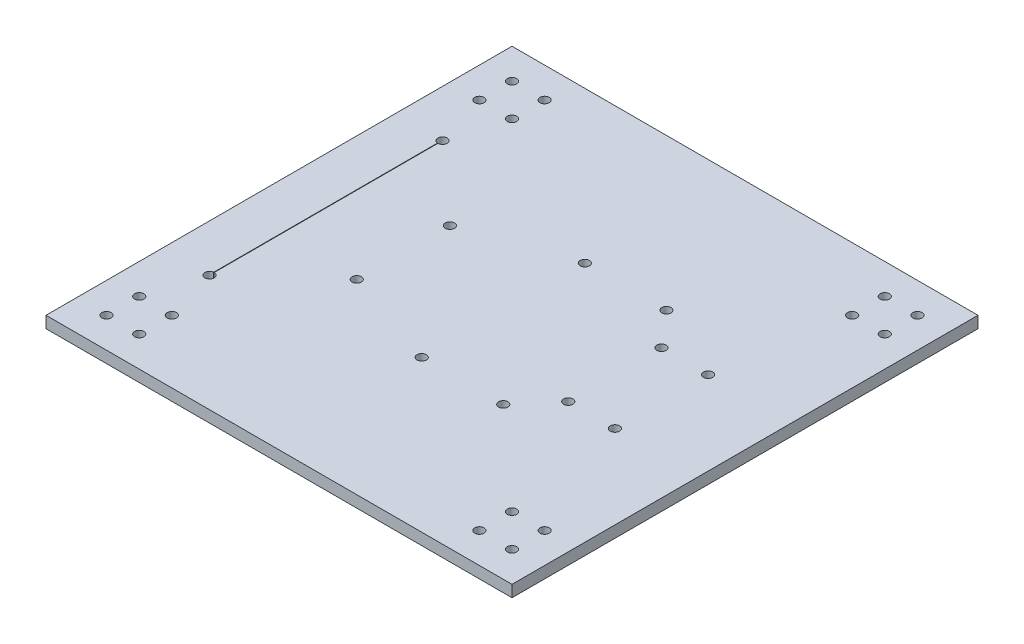
ISO-10303-21;
HEADER;
FILE_DESCRIPTION(('STEP AP214'),'2;1');
FILE_NAME('part.step','',(''),(''),'','','');
FILE_SCHEMA(('AUTOMOTIVE_DESIGN { 1 0 10303 214 1 1 1 1 }'));
ENDSEC;
DATA;
#1=APPLICATION_CONTEXT('core data for automotive mechanical design processes');
#2=APPLICATION_PROTOCOL_DEFINITION('international standard','automotive_design',2000,#1);
#3=PRODUCT_CONTEXT('',#1,'mechanical');
#4=PRODUCT('Part','Part','',(#3));
#5=PRODUCT_RELATED_PRODUCT_CATEGORY('part','',(#4));
#6=PRODUCT_DEFINITION_FORMATION('','',#4);
#7=PRODUCT_DEFINITION_CONTEXT('part definition',#1,'design');
#8=PRODUCT_DEFINITION('design','',#6,#7);
#9=PRODUCT_DEFINITION_SHAPE('','',#8);
#10=(LENGTH_UNIT() NAMED_UNIT(*) SI_UNIT(.MILLI.,.METRE.));
#11=(NAMED_UNIT(*) PLANE_ANGLE_UNIT() SI_UNIT($,.RADIAN.));
#12=(NAMED_UNIT(*) SI_UNIT($,.STERADIAN.) SOLID_ANGLE_UNIT());
#13=UNCERTAINTY_MEASURE_WITH_UNIT(LENGTH_MEASURE(1.E-05),#10,'distance_accuracy_value','');
#14=(GEOMETRIC_REPRESENTATION_CONTEXT(3) GLOBAL_UNCERTAINTY_ASSIGNED_CONTEXT((#13)) GLOBAL_UNIT_ASSIGNED_CONTEXT((#10,
#11,#12)) REPRESENTATION_CONTEXT('',''));
#15=CARTESIAN_POINT('',(0.,0.,0.));
#16=DIRECTION('',(0.,0.,1.));
#17=DIRECTION('',(1.,0.,0.));
#18=AXIS2_PLACEMENT_3D('',#15,#16,#17);
#19=CARTESIAN_POINT('',(0.,5.,-100.));
#20=DIRECTION('',(0.,0.,-1.));
#21=DIRECTION('',(-1.,0.,0.));
#22=AXIS2_PLACEMENT_3D('',#19,#20,#21);
#23=PLANE('',#22);
#24=DIRECTION('',(1.,0.,0.));
#25=VECTOR('',#24,1.);
#26=CARTESIAN_POINT('',(0.,0.,-100.));
#27=LINE('',#26,#25);
#28=CARTESIAN_POINT('',(-100.,0.,-100.));
#29=VERTEX_POINT('',#28);
#30=CARTESIAN_POINT('',(100.,0.,-100.));
#31=VERTEX_POINT('',#30);
#32=EDGE_CURVE('E178',#29,#31,#27,.T.);
#33=ORIENTED_EDGE('',*,*,#32,.F.);
#34=DIRECTION('',(0.,-1.,0.));
#35=VECTOR('',#34,1.);
#36=CARTESIAN_POINT('',(-100.,5.,-100.));
#37=LINE('',#36,#35);
#38=CARTESIAN_POINT('',(-100.,5.,-100.));
#39=VERTEX_POINT('',#38);
#40=EDGE_CURVE('E11',#39,#29,#37,.T.);
#41=ORIENTED_EDGE('',*,*,#40,.F.);
#42=DIRECTION('',(1.,0.,0.));
#43=VECTOR('',#42,1.);
#44=CARTESIAN_POINT('',(0.,5.,-100.));
#45=LINE('',#44,#43);
#46=CARTESIAN_POINT('',(100.,5.,-100.));
#47=VERTEX_POINT('',#46);
#48=EDGE_CURVE('E129',#39,#47,#45,.T.);
#49=ORIENTED_EDGE('',*,*,#48,.T.);
#50=DIRECTION('',(0.,-1.,0.));
#51=VECTOR('',#50,1.);
#52=CARTESIAN_POINT('',(100.,5.,-100.));
#53=LINE('',#52,#51);
#54=EDGE_CURVE('E61',#47,#31,#53,.T.);
#55=ORIENTED_EDGE('',*,*,#54,.T.);
#56=EDGE_LOOP('',(#33,#41,#49,#55));
#57=FACE_BOUND('',#56,.T.);
#58=ADVANCED_FACE('F41',(#57),#23,.T.);
#59=CARTESIAN_POINT('',(-100.,5.,0.));
#60=DIRECTION('',(1.,0.,0.));
#61=DIRECTION('',(0.,0.,-1.));
#62=AXIS2_PLACEMENT_3D('',#59,#60,#61);
#63=PLANE('',#62);
#64=DIRECTION('',(0.,0.,1.));
#65=VECTOR('',#64,1.);
#66=CARTESIAN_POINT('',(-100.,0.,0.));
#67=LINE('',#66,#65);
#68=CARTESIAN_POINT('',(-100.,0.,100.));
#69=VERTEX_POINT('',#68);
#70=EDGE_CURVE('E135',#29,#69,#67,.T.);
#71=ORIENTED_EDGE('',*,*,#70,.T.);
#72=DIRECTION('',(0.,-1.,0.));
#73=VECTOR('',#72,1.);
#74=CARTESIAN_POINT('',(-100.,5.,100.));
#75=LINE('',#74,#73);
#76=CARTESIAN_POINT('',(-100.,5.,100.));
#77=VERTEX_POINT('',#76);
#78=EDGE_CURVE('E52',#77,#69,#75,.T.);
#79=ORIENTED_EDGE('',*,*,#78,.F.);
#80=DIRECTION('',(0.,0.,1.));
#81=VECTOR('',#80,1.);
#82=CARTESIAN_POINT('',(-100.,5.,0.));
#83=LINE('',#82,#81);
#84=EDGE_CURVE('E123',#39,#77,#83,.T.);
#85=ORIENTED_EDGE('',*,*,#84,.F.);
#86=ORIENTED_EDGE('',*,*,#40,.T.);
#87=EDGE_LOOP('',(#71,#79,#85,#86));
#88=FACE_BOUND('',#87,.T.);
#89=ADVANCED_FACE('F133',(#88),#63,.F.);
#90=CARTESIAN_POINT('',(0.,5.,100.));
#91=DIRECTION('',(0.,0.,-1.));
#92=DIRECTION('',(-1.,0.,0.));
#93=AXIS2_PLACEMENT_3D('',#90,#91,#92);
#94=PLANE('',#93);
#95=DIRECTION('',(1.,0.,0.));
#96=VECTOR('',#95,1.);
#97=CARTESIAN_POINT('',(0.,0.,100.));
#98=LINE('',#97,#96);
#99=CARTESIAN_POINT('',(100.,0.,100.));
#100=VERTEX_POINT('',#99);
#101=EDGE_CURVE('E173',#69,#100,#98,.T.);
#102=ORIENTED_EDGE('',*,*,#101,.T.);
#103=DIRECTION('',(0.,-1.,0.));
#104=VECTOR('',#103,1.);
#105=CARTESIAN_POINT('',(100.,5.,100.));
#106=LINE('',#105,#104);
#107=CARTESIAN_POINT('',(100.,5.,100.));
#108=VERTEX_POINT('',#107);
#109=EDGE_CURVE('E87',#108,#100,#106,.T.);
#110=ORIENTED_EDGE('',*,*,#109,.F.);
#111=DIRECTION('',(1.,0.,0.));
#112=VECTOR('',#111,1.);
#113=CARTESIAN_POINT('',(0.,5.,100.));
#114=LINE('',#113,#112);
#115=EDGE_CURVE('E114',#77,#108,#114,.T.);
#116=ORIENTED_EDGE('',*,*,#115,.F.);
#117=ORIENTED_EDGE('',*,*,#78,.T.);
#118=EDGE_LOOP('',(#102,#110,#116,#117));
#119=FACE_BOUND('',#118,.T.);
#120=ADVANCED_FACE('F116',(#119),#94,.F.);
#121=CARTESIAN_POINT('',(-79.8057915057915,5.,-50.));
#122=DIRECTION('',(0.,-1.,0.));
#123=DIRECTION('',(0.,0.,-1.));
#124=AXIS2_PLACEMENT_3D('',#121,#122,#123);
#125=CYLINDRICAL_SURFACE('',#124,2.);
#126=CARTESIAN_POINT('',(-79.8057915057915,0.,-50.));
#127=DIRECTION('',(0.,1.,0.));
#128=DIRECTION('',(0.,0.,1.));
#129=AXIS2_PLACEMENT_3D('',#126,#127,#128);
#130=CIRCLE('',#129,2.);
#131=CARTESIAN_POINT('',(-79.8057915057915,0.,-48.));
#132=VERTEX_POINT('',#131);
#133=CARTESIAN_POINT('',(-80.,0.,-48.0094515678393));
#134=VERTEX_POINT('',#133);
#135=EDGE_CURVE('E264',#132,#134,#130,.T.);
#136=ORIENTED_EDGE('',*,*,#135,.F.);
#137=DIRECTION('',(0.,-1.,0.));
#138=VECTOR('',#137,1.);
#139=CARTESIAN_POINT('',(-79.8057915057915,5.,-48.));
#140=LINE('',#139,#138);
#141=CARTESIAN_POINT('',(-79.8057915057915,5.,-48.));
#142=VERTEX_POINT('',#141);
#143=EDGE_CURVE('E45',#142,#132,#140,.T.);
#144=ORIENTED_EDGE('',*,*,#143,.F.);
#145=CARTESIAN_POINT('',(-79.8057915057915,5.,-50.));
#146=DIRECTION('',(0.,1.,0.));
#147=DIRECTION('',(0.,0.,1.));
#148=AXIS2_PLACEMENT_3D('',#145,#146,#147);
#149=CIRCLE('',#148,2.);
#150=CARTESIAN_POINT('',(-80.,5.,-48.0094515678393));
#151=VERTEX_POINT('',#150);
#152=EDGE_CURVE('E384',#142,#151,#149,.T.);
#153=ORIENTED_EDGE('',*,*,#152,.T.);
#154=DIRECTION('',(0.,-1.,0.));
#155=VECTOR('',#154,1.);
#156=CARTESIAN_POINT('',(-80.,5.,-48.0094515678393));
#157=LINE('',#156,#155);
#158=EDGE_CURVE('E142',#151,#134,#157,.T.);
#159=ORIENTED_EDGE('',*,*,#158,.T.);
#160=EDGE_LOOP('',(#136,#144,#153,#159));
#161=FACE_BOUND('',#160,.T.);
#162=ADVANCED_FACE('F578',(#161),#125,.F.);
#163=CARTESIAN_POINT('',(-79.8057915057915,5.,0.));
#164=DIRECTION('',(1.,0.,0.));
#165=DIRECTION('',(0.,0.,-1.));
#166=AXIS2_PLACEMENT_3D('',#163,#164,#165);
#167=PLANE('',#166);
#168=DIRECTION('',(0.,0.,1.));
#169=VECTOR('',#168,1.);
#170=CARTESIAN_POINT('',(-79.8057915057915,0.,0.));
#171=LINE('',#170,#169);
#172=CARTESIAN_POINT('',(-79.8057915057915,0.,48.));
#173=VERTEX_POINT('',#172);
#174=EDGE_CURVE('E261',#132,#173,#171,.T.);
#175=ORIENTED_EDGE('',*,*,#174,.T.);
#176=DIRECTION('',(0.,-1.,0.));
#177=VECTOR('',#176,1.);
#178=CARTESIAN_POINT('',(-79.8057915057915,5.,48.));
#179=LINE('',#178,#177);
#180=CARTESIAN_POINT('',(-79.8057915057915,5.,48.));
#181=VERTEX_POINT('',#180);
#182=EDGE_CURVE('E148',#181,#173,#179,.T.);
#183=ORIENTED_EDGE('',*,*,#182,.F.);
#184=DIRECTION('',(0.,0.,1.));
#185=VECTOR('',#184,1.);
#186=CARTESIAN_POINT('',(-79.8057915057915,5.,0.));
#187=LINE('',#186,#185);
#188=EDGE_CURVE('E381',#142,#181,#187,.T.);
#189=ORIENTED_EDGE('',*,*,#188,.F.);
#190=ORIENTED_EDGE('',*,*,#143,.T.);
#191=EDGE_LOOP('',(#175,#183,#189,#190));
#192=FACE_BOUND('',#191,.T.);
#193=ADVANCED_FACE('F575',(#192),#167,.F.);
#194=CARTESIAN_POINT('',(-79.8057915057915,5.,50.));
#195=DIRECTION('',(0.,-1.,0.));
#196=DIRECTION('',(0.,0.,-1.));
#197=AXIS2_PLACEMENT_3D('',#194,#195,#196);
#198=CYLINDRICAL_SURFACE('',#197,2.);
#199=CARTESIAN_POINT('',(-79.8057915057915,0.,50.));
#200=DIRECTION('',(0.,1.,0.));
#201=DIRECTION('',(0.,0.,1.));
#202=AXIS2_PLACEMENT_3D('',#199,#200,#201);
#203=CIRCLE('',#202,2.);
#204=CARTESIAN_POINT('',(-80.,0.,48.0094515678393));
#205=VERTEX_POINT('',#204);
#206=EDGE_CURVE('E257',#205,#173,#203,.T.);
#207=ORIENTED_EDGE('',*,*,#206,.F.);
#208=DIRECTION('',(0.,-1.,0.));
#209=VECTOR('',#208,1.);
#210=CARTESIAN_POINT('',(-80.,5.,48.0094515678393));
#211=LINE('',#210,#209);
#212=CARTESIAN_POINT('',(-80.,5.,48.0094515678393));
#213=VERTEX_POINT('',#212);
#214=EDGE_CURVE('E145',#213,#205,#211,.T.);
#215=ORIENTED_EDGE('',*,*,#214,.F.);
#216=CARTESIAN_POINT('',(-79.8057915057915,5.,50.));
#217=DIRECTION('',(0.,1.,0.));
#218=DIRECTION('',(0.,0.,1.));
#219=AXIS2_PLACEMENT_3D('',#216,#217,#218);
#220=CIRCLE('',#219,2.);
#221=EDGE_CURVE('E378',#213,#181,#220,.T.);
#222=ORIENTED_EDGE('',*,*,#221,.T.);
#223=ORIENTED_EDGE('',*,*,#182,.T.);
#224=EDGE_LOOP('',(#207,#215,#222,#223));
#225=FACE_BOUND('',#224,.T.);
#226=ADVANCED_FACE('F571',(#225),#198,.F.);
#227=CARTESIAN_POINT('',(-46.6325171431204,5.,20.));
#228=DIRECTION('',(0.,-1.,0.));
#229=DIRECTION('',(0.,0.,-1.));
#230=AXIS2_PLACEMENT_3D('',#227,#228,#229);
#231=CYLINDRICAL_SURFACE('',#230,2.);
#232=CARTESIAN_POINT('',(-46.6325171431204,5.,20.));
#233=DIRECTION('',(0.,1.,0.));
#234=DIRECTION('',(0.,0.,1.));
#235=AXIS2_PLACEMENT_3D('',#232,#233,#234);
#236=CIRCLE('',#235,2.);
#237=CARTESIAN_POINT('',(-46.6325171431204,5.,22.));
#238=VERTEX_POINT('',#237);
#239=EDGE_CURVE('E295',#238,#238,#236,.T.);
#240=ORIENTED_EDGE('',*,*,#239,.T.);
#241=EDGE_LOOP('',(#240));
#242=FACE_BOUND('',#241,.T.);
#243=CARTESIAN_POINT('',(-46.6325171431204,0.,20.));
#244=DIRECTION('',(0.,1.,0.));
#245=DIRECTION('',(0.,0.,1.));
#246=AXIS2_PLACEMENT_3D('',#243,#244,#245);
#247=CIRCLE('',#246,2.);
#248=CARTESIAN_POINT('',(-46.6325171431204,0.,22.));
#249=VERTEX_POINT('',#248);
#250=EDGE_CURVE('E165',#249,#249,#247,.T.);
#251=ORIENTED_EDGE('',*,*,#250,.F.);
#252=EDGE_LOOP('',(#251));
#253=FACE_BOUND('',#252,.T.);
#254=ADVANCED_FACE('F574',(#242,#253),#231,.F.);
#255=CARTESIAN_POINT('',(100.,5.,0.));
#256=DIRECTION('',(1.,0.,0.));
#257=DIRECTION('',(0.,0.,-1.));
#258=AXIS2_PLACEMENT_3D('',#255,#256,#257);
#259=PLANE('',#258);
#260=DIRECTION('',(0.,0.,1.));
#261=VECTOR('',#260,1.);
#262=CARTESIAN_POINT('',(100.,0.,0.));
#263=LINE('',#262,#261);
#264=EDGE_CURVE('E169',#31,#100,#263,.T.);
#265=ORIENTED_EDGE('',*,*,#264,.F.);
#266=ORIENTED_EDGE('',*,*,#54,.F.);
#267=DIRECTION('',(0.,0.,1.));
#268=VECTOR('',#267,1.);
#269=CARTESIAN_POINT('',(100.,5.,0.));
#270=LINE('',#269,#268);
#271=EDGE_CURVE('E122',#47,#108,#270,.T.);
#272=ORIENTED_EDGE('',*,*,#271,.T.);
#273=ORIENTED_EDGE('',*,*,#109,.T.);
#274=EDGE_LOOP('',(#265,#266,#272,#273));
#275=FACE_BOUND('',#274,.T.);
#276=ADVANCED_FACE('F470',(#275),#259,.T.);
#277=CARTESIAN_POINT('',(87.,5.,73.0000000000001));
#278=DIRECTION('',(0.,-1.,0.));
#279=DIRECTION('',(0.,0.,-1.));
#280=AXIS2_PLACEMENT_3D('',#277,#278,#279);
#281=CYLINDRICAL_SURFACE('',#280,2.);
#282=CARTESIAN_POINT('',(87.,5.,73.0000000000001));
#283=DIRECTION('',(0.,1.,0.));
#284=DIRECTION('',(0.,0.,1.));
#285=AXIS2_PLACEMENT_3D('',#282,#283,#284);
#286=CIRCLE('',#285,2.);
#287=CARTESIAN_POINT('',(87.,5.,75.0000000000001));
#288=VERTEX_POINT('',#287);
#289=EDGE_CURVE('E303',#288,#288,#286,.T.);
#290=ORIENTED_EDGE('',*,*,#289,.T.);
#291=EDGE_LOOP('',(#290));
#292=FACE_BOUND('',#291,.T.);
#293=CARTESIAN_POINT('',(87.,0.,73.0000000000001));
#294=DIRECTION('',(0.,1.,0.));
#295=DIRECTION('',(0.,0.,1.));
#296=AXIS2_PLACEMENT_3D('',#293,#294,#295);
#297=CIRCLE('',#296,2.);
#298=CARTESIAN_POINT('',(87.,0.,75.0000000000001));
#299=VERTEX_POINT('',#298);
#300=EDGE_CURVE('E181',#299,#299,#297,.T.);
#301=ORIENTED_EDGE('',*,*,#300,.F.);
#302=EDGE_LOOP('',(#301));
#303=FACE_BOUND('',#302,.T.);
#304=ADVANCED_FACE('F466',(#292,#303),#281,.F.);
#305=CARTESIAN_POINT('',(-87.,5.,73.));
#306=DIRECTION('',(0.,-1.,0.));
#307=DIRECTION('',(0.,0.,-1.));
#308=AXIS2_PLACEMENT_3D('',#305,#306,#307);
#309=CYLINDRICAL_SURFACE('',#308,2.);
#310=CARTESIAN_POINT('',(-87.,5.,73.));
#311=DIRECTION('',(0.,1.,0.));
#312=DIRECTION('',(0.,0.,1.));
#313=AXIS2_PLACEMENT_3D('',#310,#311,#312);
#314=CIRCLE('',#313,2.);
#315=CARTESIAN_POINT('',(-87.,5.,75.));
#316=VERTEX_POINT('',#315);
#317=EDGE_CURVE('E307',#316,#316,#314,.T.);
#318=ORIENTED_EDGE('',*,*,#317,.T.);
#319=EDGE_LOOP('',(#318));
#320=FACE_BOUND('',#319,.T.);
#321=CARTESIAN_POINT('',(-87.,0.,73.));
#322=DIRECTION('',(0.,1.,0.));
#323=DIRECTION('',(0.,0.,1.));
#324=AXIS2_PLACEMENT_3D('',#321,#322,#323);
#325=CIRCLE('',#324,2.);
#326=CARTESIAN_POINT('',(-87.,0.,75.));
#327=VERTEX_POINT('',#326);
#328=EDGE_CURVE('E185',#327,#327,#325,.T.);
#329=ORIENTED_EDGE('',*,*,#328,.F.);
#330=EDGE_LOOP('',(#329));
#331=FACE_BOUND('',#330,.T.);
#332=ADVANCED_FACE('F469',(#320,#331),#309,.F.);
#333=CARTESIAN_POINT('',(-3.74802040788834,5.,35.));
#334=DIRECTION('',(0.,-1.,0.));
#335=DIRECTION('',(0.,0.,-1.));
#336=AXIS2_PLACEMENT_3D('',#333,#334,#335);
#337=CYLINDRICAL_SURFACE('',#336,2.);
#338=CARTESIAN_POINT('',(-3.74802040788834,5.,35.));
#339=DIRECTION('',(0.,1.,0.));
#340=DIRECTION('',(0.,0.,1.));
#341=AXIS2_PLACEMENT_3D('',#338,#339,#340);
#342=CIRCLE('',#341,2.);
#343=CARTESIAN_POINT('',(-3.74802040788834,5.,37.));
#344=VERTEX_POINT('',#343);
#345=EDGE_CURVE('E311',#344,#344,#342,.T.);
#346=ORIENTED_EDGE('',*,*,#345,.T.);
#347=EDGE_LOOP('',(#346));
#348=FACE_BOUND('',#347,.T.);
#349=CARTESIAN_POINT('',(-3.74802040788834,0.,35.));
#350=DIRECTION('',(0.,1.,0.));
#351=DIRECTION('',(0.,0.,1.));
#352=AXIS2_PLACEMENT_3D('',#349,#350,#351);
#353=CIRCLE('',#352,2.);
#354=CARTESIAN_POINT('',(-3.74802040788834,0.,37.));
#355=VERTEX_POINT('',#354);
#356=EDGE_CURVE('E189',#355,#355,#353,.T.);
#357=ORIENTED_EDGE('',*,*,#356,.F.);
#358=EDGE_LOOP('',(#357));
#359=FACE_BOUND('',#358,.T.);
#360=ADVANCED_FACE('F501',(#348,#359),#337,.F.);
#361=CARTESIAN_POINT('',(-87.,5.,87.));
#362=DIRECTION('',(0.,-1.,0.));
#363=DIRECTION('',(0.,0.,-1.));
#364=AXIS2_PLACEMENT_3D('',#361,#362,#363);
#365=CYLINDRICAL_SURFACE('',#364,2.);
#366=CARTESIAN_POINT('',(-87.,5.,87.));
#367=DIRECTION('',(0.,1.,0.));
#368=DIRECTION('',(0.,0.,1.));
#369=AXIS2_PLACEMENT_3D('',#366,#367,#368);
#370=CIRCLE('',#369,2.);
#371=CARTESIAN_POINT('',(-87.,5.,89.));
#372=VERTEX_POINT('',#371);
#373=EDGE_CURVE('E315',#372,#372,#370,.T.);
#374=ORIENTED_EDGE('',*,*,#373,.T.);
#375=EDGE_LOOP('',(#374));
#376=FACE_BOUND('',#375,.T.);
#377=CARTESIAN_POINT('',(-87.,0.,87.));
#378=DIRECTION('',(0.,1.,0.));
#379=DIRECTION('',(0.,0.,1.));
#380=AXIS2_PLACEMENT_3D('',#377,#378,#379);
#381=CIRCLE('',#380,2.);
#382=CARTESIAN_POINT('',(-87.,0.,89.));
#383=VERTEX_POINT('',#382);
#384=EDGE_CURVE('E193',#383,#383,#381,.T.);
#385=ORIENTED_EDGE('',*,*,#384,.F.);
#386=EDGE_LOOP('',(#385));
#387=FACE_BOUND('',#386,.T.);
#388=ADVANCED_FACE('F505',(#376,#387),#365,.F.);
#389=CARTESIAN_POINT('',(73.,5.,73.0000000000001));
#390=DIRECTION('',(0.,-1.,0.));
#391=DIRECTION('',(0.,0.,-1.));
#392=AXIS2_PLACEMENT_3D('',#389,#390,#391);
#393=CYLINDRICAL_SURFACE('',#392,2.);
#394=CARTESIAN_POINT('',(73.,5.,73.0000000000001));
#395=DIRECTION('',(0.,1.,0.));
#396=DIRECTION('',(0.,0.,1.));
#397=AXIS2_PLACEMENT_3D('',#394,#395,#396);
#398=CIRCLE('',#397,2.);
#399=CARTESIAN_POINT('',(73.,5.,75.0000000000001));
#400=VERTEX_POINT('',#399);
#401=EDGE_CURVE('E319',#400,#400,#398,.T.);
#402=ORIENTED_EDGE('',*,*,#401,.T.);
#403=EDGE_LOOP('',(#402));
#404=FACE_BOUND('',#403,.T.);
#405=CARTESIAN_POINT('',(73.,0.,73.0000000000001));
#406=DIRECTION('',(0.,1.,0.));
#407=DIRECTION('',(0.,0.,1.));
#408=AXIS2_PLACEMENT_3D('',#405,#406,#407);
#409=CIRCLE('',#408,2.);
#410=CARTESIAN_POINT('',(73.,0.,75.0000000000001));
#411=VERTEX_POINT('',#410);
#412=EDGE_CURVE('E197',#411,#411,#409,.T.);
#413=ORIENTED_EDGE('',*,*,#412,.F.);
#414=EDGE_LOOP('',(#413));
#415=FACE_BOUND('',#414,.T.);
#416=ADVANCED_FACE('F509',(#404,#415),#393,.F.);
#417=CARTESIAN_POINT('',(-73.,5.,87.));
#418=DIRECTION('',(0.,-1.,0.));
#419=DIRECTION('',(0.,0.,-1.));
#420=AXIS2_PLACEMENT_3D('',#417,#418,#419);
#421=CYLINDRICAL_SURFACE('',#420,2.);
#422=CARTESIAN_POINT('',(-73.,5.,87.));
#423=DIRECTION('',(0.,1.,0.));
#424=DIRECTION('',(0.,0.,1.));
#425=AXIS2_PLACEMENT_3D('',#422,#423,#424);
#426=CIRCLE('',#425,2.);
#427=CARTESIAN_POINT('',(-73.,5.,89.));
#428=VERTEX_POINT('',#427);
#429=EDGE_CURVE('E323',#428,#428,#426,.T.);
#430=ORIENTED_EDGE('',*,*,#429,.T.);
#431=EDGE_LOOP('',(#430));
#432=FACE_BOUND('',#431,.T.);
#433=CARTESIAN_POINT('',(-73.,0.,87.));
#434=DIRECTION('',(0.,1.,0.));
#435=DIRECTION('',(0.,0.,1.));
#436=AXIS2_PLACEMENT_3D('',#433,#434,#435);
#437=CIRCLE('',#436,2.);
#438=CARTESIAN_POINT('',(-73.,0.,89.));
#439=VERTEX_POINT('',#438);
#440=EDGE_CURVE('E201',#439,#439,#437,.T.);
#441=ORIENTED_EDGE('',*,*,#440,.F.);
#442=EDGE_LOOP('',(#441));
#443=FACE_BOUND('',#442,.T.);
#444=ADVANCED_FACE('F513',(#432,#443),#421,.F.);
#445=CARTESIAN_POINT('',(73.,5.,87.));
#446=DIRECTION('',(0.,-1.,0.));
#447=DIRECTION('',(0.,0.,-1.));
#448=AXIS2_PLACEMENT_3D('',#445,#446,#447);
#449=CYLINDRICAL_SURFACE('',#448,2.);
#450=CARTESIAN_POINT('',(73.,5.,87.));
#451=DIRECTION('',(0.,1.,0.));
#452=DIRECTION('',(0.,0.,1.));
#453=AXIS2_PLACEMENT_3D('',#450,#451,#452);
#454=CIRCLE('',#453,2.);
#455=CARTESIAN_POINT('',(73.,5.,89.0000000000001));
#456=VERTEX_POINT('',#455);
#457=EDGE_CURVE('E327',#456,#456,#454,.T.);
#458=ORIENTED_EDGE('',*,*,#457,.T.);
#459=EDGE_LOOP('',(#458));
#460=FACE_BOUND('',#459,.T.);
#461=CARTESIAN_POINT('',(73.,0.,87.));
#462=DIRECTION('',(0.,1.,0.));
#463=DIRECTION('',(0.,0.,1.));
#464=AXIS2_PLACEMENT_3D('',#461,#462,#463);
#465=CIRCLE('',#464,2.);
#466=CARTESIAN_POINT('',(73.,0.,89.0000000000001));
#467=VERTEX_POINT('',#466);
#468=EDGE_CURVE('E205',#467,#467,#465,.T.);
#469=ORIENTED_EDGE('',*,*,#468,.F.);
#470=EDGE_LOOP('',(#469));
#471=FACE_BOUND('',#470,.T.);
#472=ADVANCED_FACE('F517',(#460,#471),#449,.F.);
#473=CARTESIAN_POINT('',(87.,5.,87.));
#474=DIRECTION('',(0.,-1.,0.));
#475=DIRECTION('',(0.,0.,-1.));
#476=AXIS2_PLACEMENT_3D('',#473,#474,#475);
#477=CYLINDRICAL_SURFACE('',#476,2.);
#478=CARTESIAN_POINT('',(87.,5.,87.));
#479=DIRECTION('',(0.,1.,0.));
#480=DIRECTION('',(0.,0.,1.));
#481=AXIS2_PLACEMENT_3D('',#478,#479,#480);
#482=CIRCLE('',#481,2.);
#483=CARTESIAN_POINT('',(87.,5.,89.0000000000001));
#484=VERTEX_POINT('',#483);
#485=EDGE_CURVE('E331',#484,#484,#482,.T.);
#486=ORIENTED_EDGE('',*,*,#485,.T.);
#487=EDGE_LOOP('',(#486));
#488=FACE_BOUND('',#487,.T.);
#489=CARTESIAN_POINT('',(87.,0.,87.));
#490=DIRECTION('',(0.,1.,0.));
#491=DIRECTION('',(0.,0.,1.));
#492=AXIS2_PLACEMENT_3D('',#489,#490,#491);
#493=CIRCLE('',#492,2.);
#494=CARTESIAN_POINT('',(87.,0.,89.0000000000001));
#495=VERTEX_POINT('',#494);
#496=EDGE_CURVE('E209',#495,#495,#493,.T.);
#497=ORIENTED_EDGE('',*,*,#496,.F.);
#498=EDGE_LOOP('',(#497));
#499=FACE_BOUND('',#498,.T.);
#500=ADVANCED_FACE('F521',(#488,#499),#477,.F.);
#501=CARTESIAN_POINT('',(-73.,5.,73.));
#502=DIRECTION('',(0.,-1.,0.));
#503=DIRECTION('',(0.,0.,-1.));
#504=AXIS2_PLACEMENT_3D('',#501,#502,#503);
#505=CYLINDRICAL_SURFACE('',#504,2.);
#506=CARTESIAN_POINT('',(-73.,5.,73.));
#507=DIRECTION('',(0.,1.,0.));
#508=DIRECTION('',(0.,0.,1.));
#509=AXIS2_PLACEMENT_3D('',#506,#507,#508);
#510=CIRCLE('',#509,2.);
#511=CARTESIAN_POINT('',(-73.,5.,75.));
#512=VERTEX_POINT('',#511);
#513=EDGE_CURVE('E335',#512,#512,#510,.T.);
#514=ORIENTED_EDGE('',*,*,#513,.T.);
#515=EDGE_LOOP('',(#514));
#516=FACE_BOUND('',#515,.T.);
#517=CARTESIAN_POINT('',(-73.,0.,73.));
#518=DIRECTION('',(0.,1.,0.));
#519=DIRECTION('',(0.,0.,1.));
#520=AXIS2_PLACEMENT_3D('',#517,#518,#519);
#521=CIRCLE('',#520,2.);
#522=CARTESIAN_POINT('',(-73.,0.,75.));
#523=VERTEX_POINT('',#522);
#524=EDGE_CURVE('E213',#523,#523,#521,.T.);
#525=ORIENTED_EDGE('',*,*,#524,.F.);
#526=EDGE_LOOP('',(#525));
#527=FACE_BOUND('',#526,.T.);
#528=ADVANCED_FACE('F525',(#516,#527),#505,.F.);
#529=CARTESIAN_POINT('',(-3.74802040788834,5.,-35.));
#530=DIRECTION('',(0.,-1.,0.));
#531=DIRECTION('',(0.,0.,-1.));
#532=AXIS2_PLACEMENT_3D('',#529,#530,#531);
#533=CYLINDRICAL_SURFACE('',#532,2.);
#534=CARTESIAN_POINT('',(-3.74802040788834,5.,-35.));
#535=DIRECTION('',(0.,1.,0.));
#536=DIRECTION('',(0.,0.,1.));
#537=AXIS2_PLACEMENT_3D('',#534,#535,#536);
#538=CIRCLE('',#537,2.);
#539=CARTESIAN_POINT('',(-3.74802040788834,5.,-33.));
#540=VERTEX_POINT('',#539);
#541=EDGE_CURVE('E339',#540,#540,#538,.T.);
#542=ORIENTED_EDGE('',*,*,#541,.T.);
#543=EDGE_LOOP('',(#542));
#544=FACE_BOUND('',#543,.T.);
#545=CARTESIAN_POINT('',(-3.74802040788834,0.,-35.));
#546=DIRECTION('',(0.,1.,0.));
#547=DIRECTION('',(0.,0.,1.));
#548=AXIS2_PLACEMENT_3D('',#545,#546,#547);
#549=CIRCLE('',#548,2.);
#550=CARTESIAN_POINT('',(-3.74802040788834,0.,-33.));
#551=VERTEX_POINT('',#550);
#552=EDGE_CURVE('E217',#551,#551,#549,.T.);
#553=ORIENTED_EDGE('',*,*,#552,.F.);
#554=EDGE_LOOP('',(#553));
#555=FACE_BOUND('',#554,.T.);
#556=ADVANCED_FACE('F529',(#544,#555),#533,.F.);
#557=CARTESIAN_POINT('',(31.2519795921117,5.,35.));
#558=DIRECTION('',(0.,-1.,0.));
#559=DIRECTION('',(0.,0.,-1.));
#560=AXIS2_PLACEMENT_3D('',#557,#558,#559);
#561=CYLINDRICAL_SURFACE('',#560,2.);
#562=CARTESIAN_POINT('',(31.2519795921117,5.,35.));
#563=DIRECTION('',(0.,1.,0.));
#564=DIRECTION('',(0.,0.,1.));
#565=AXIS2_PLACEMENT_3D('',#562,#563,#564);
#566=CIRCLE('',#565,2.);
#567=CARTESIAN_POINT('',(31.2519795921117,5.,37.));
#568=VERTEX_POINT('',#567);
#569=EDGE_CURVE('E343',#568,#568,#566,.T.);
#570=ORIENTED_EDGE('',*,*,#569,.T.);
#571=EDGE_LOOP('',(#570));
#572=FACE_BOUND('',#571,.T.);
#573=CARTESIAN_POINT('',(31.2519795921117,0.,35.));
#574=DIRECTION('',(0.,1.,0.));
#575=DIRECTION('',(0.,0.,1.));
#576=AXIS2_PLACEMENT_3D('',#573,#574,#575);
#577=CIRCLE('',#576,2.);
#578=CARTESIAN_POINT('',(31.2519795921117,0.,37.));
#579=VERTEX_POINT('',#578);
#580=EDGE_CURVE('E221',#579,#579,#577,.T.);
#581=ORIENTED_EDGE('',*,*,#580,.F.);
#582=EDGE_LOOP('',(#581));
#583=FACE_BOUND('',#582,.T.);
#584=ADVANCED_FACE('F533',(#572,#583),#561,.F.);
#585=CARTESIAN_POINT('',(44.1649571787766,5.,20.));
#586=DIRECTION('',(0.,-1.,0.));
#587=DIRECTION('',(0.,0.,-1.));
#588=AXIS2_PLACEMENT_3D('',#585,#586,#587);
#589=CYLINDRICAL_SURFACE('',#588,2.);
#590=CARTESIAN_POINT('',(44.1649571787766,5.,20.));
#591=DIRECTION('',(0.,1.,0.));
#592=DIRECTION('',(0.,0.,1.));
#593=AXIS2_PLACEMENT_3D('',#590,#591,#592);
#594=CIRCLE('',#593,2.);
#595=CARTESIAN_POINT('',(44.1649571787766,5.,22.));
#596=VERTEX_POINT('',#595);
#597=EDGE_CURVE('E347',#596,#596,#594,.T.);
#598=ORIENTED_EDGE('',*,*,#597,.T.);
#599=EDGE_LOOP('',(#598));
#600=FACE_BOUND('',#599,.T.);
#601=CARTESIAN_POINT('',(44.1649571787766,0.,20.));
#602=DIRECTION('',(0.,1.,0.));
#603=DIRECTION('',(0.,0.,1.));
#604=AXIS2_PLACEMENT_3D('',#601,#602,#603);
#605=CIRCLE('',#604,2.);
#606=CARTESIAN_POINT('',(44.1649571787766,0.,22.));
#607=VERTEX_POINT('',#606);
#608=EDGE_CURVE('E225',#607,#607,#605,.T.);
#609=ORIENTED_EDGE('',*,*,#608,.F.);
#610=EDGE_LOOP('',(#609));
#611=FACE_BOUND('',#610,.T.);
#612=ADVANCED_FACE('F537',(#600,#611),#589,.F.);
#613=CARTESIAN_POINT('',(44.1649571787766,5.,-20.));
#614=DIRECTION('',(0.,-1.,0.));
#615=DIRECTION('',(0.,0.,-1.));
#616=AXIS2_PLACEMENT_3D('',#613,#614,#615);
#617=CYLINDRICAL_SURFACE('',#616,2.);
#618=CARTESIAN_POINT('',(44.1649571787766,5.,-20.));
#619=DIRECTION('',(0.,1.,0.));
#620=DIRECTION('',(0.,0.,1.));
#621=AXIS2_PLACEMENT_3D('',#618,#619,#620);
#622=CIRCLE('',#621,2.);
#623=CARTESIAN_POINT('',(44.1649571787766,5.,-18.));
#624=VERTEX_POINT('',#623);
#625=EDGE_CURVE('E351',#624,#624,#622,.T.);
#626=ORIENTED_EDGE('',*,*,#625,.T.);
#627=EDGE_LOOP('',(#626));
#628=FACE_BOUND('',#627,.T.);
#629=CARTESIAN_POINT('',(44.1649571787766,0.,-20.));
#630=DIRECTION('',(0.,1.,0.));
#631=DIRECTION('',(0.,0.,1.));
#632=AXIS2_PLACEMENT_3D('',#629,#630,#631);
#633=CIRCLE('',#632,2.);
#634=CARTESIAN_POINT('',(44.1649571787766,0.,-18.));
#635=VERTEX_POINT('',#634);
#636=EDGE_CURVE('E229',#635,#635,#633,.T.);
#637=ORIENTED_EDGE('',*,*,#636,.F.);
#638=EDGE_LOOP('',(#637));
#639=FACE_BOUND('',#638,.T.);
#640=ADVANCED_FACE('F541',(#628,#639),#617,.F.);
#641=CARTESIAN_POINT('',(64.1649571787766,5.,20.));
#642=DIRECTION('',(0.,-1.,0.));
#643=DIRECTION('',(0.,0.,-1.));
#644=AXIS2_PLACEMENT_3D('',#641,#642,#643);
#645=CYLINDRICAL_SURFACE('',#644,2.);
#646=CARTESIAN_POINT('',(64.1649571787766,5.,20.));
#647=DIRECTION('',(0.,1.,0.));
#648=DIRECTION('',(0.,0.,1.));
#649=AXIS2_PLACEMENT_3D('',#646,#647,#648);
#650=CIRCLE('',#649,2.);
#651=CARTESIAN_POINT('',(64.1649571787766,5.,22.));
#652=VERTEX_POINT('',#651);
#653=EDGE_CURVE('E355',#652,#652,#650,.T.);
#654=ORIENTED_EDGE('',*,*,#653,.T.);
#655=EDGE_LOOP('',(#654));
#656=FACE_BOUND('',#655,.T.);
#657=CARTESIAN_POINT('',(64.1649571787766,0.,20.));
#658=DIRECTION('',(0.,1.,0.));
#659=DIRECTION('',(0.,0.,1.));
#660=AXIS2_PLACEMENT_3D('',#657,#658,#659);
#661=CIRCLE('',#660,2.);
#662=CARTESIAN_POINT('',(64.1649571787766,0.,22.));
#663=VERTEX_POINT('',#662);
#664=EDGE_CURVE('E233',#663,#663,#661,.T.);
#665=ORIENTED_EDGE('',*,*,#664,.F.);
#666=EDGE_LOOP('',(#665));
#667=FACE_BOUND('',#666,.T.);
#668=ADVANCED_FACE('F545',(#656,#667),#645,.F.);
#669=CARTESIAN_POINT('',(73.,5.,-87.));
#670=DIRECTION('',(0.,-1.,0.));
#671=DIRECTION('',(0.,0.,-1.));
#672=AXIS2_PLACEMENT_3D('',#669,#670,#671);
#673=CYLINDRICAL_SURFACE('',#672,2.);
#674=CARTESIAN_POINT('',(73.,5.,-87.));
#675=DIRECTION('',(0.,1.,0.));
#676=DIRECTION('',(0.,0.,1.));
#677=AXIS2_PLACEMENT_3D('',#674,#675,#676);
#678=CIRCLE('',#677,2.);
#679=CARTESIAN_POINT('',(73.,5.,-85.));
#680=VERTEX_POINT('',#679);
#681=EDGE_CURVE('E359',#680,#680,#678,.T.);
#682=ORIENTED_EDGE('',*,*,#681,.T.);
#683=EDGE_LOOP('',(#682));
#684=FACE_BOUND('',#683,.T.);
#685=CARTESIAN_POINT('',(73.,0.,-87.));
#686=DIRECTION('',(0.,1.,0.));
#687=DIRECTION('',(0.,0.,1.));
#688=AXIS2_PLACEMENT_3D('',#685,#686,#687);
#689=CIRCLE('',#688,2.);
#690=CARTESIAN_POINT('',(73.,0.,-85.));
#691=VERTEX_POINT('',#690);
#692=EDGE_CURVE('E237',#691,#691,#689,.T.);
#693=ORIENTED_EDGE('',*,*,#692,.F.);
#694=EDGE_LOOP('',(#693));
#695=FACE_BOUND('',#694,.T.);
#696=ADVANCED_FACE('F549',(#684,#695),#673,.F.);
#697=CARTESIAN_POINT('',(-87.,5.,-87.));
#698=DIRECTION('',(0.,-1.,0.));
#699=DIRECTION('',(0.,0.,-1.));
#700=AXIS2_PLACEMENT_3D('',#697,#698,#699);
#701=CYLINDRICAL_SURFACE('',#700,2.);
#702=CARTESIAN_POINT('',(-87.,5.,-87.));
#703=DIRECTION('',(0.,1.,0.));
#704=DIRECTION('',(0.,0.,1.));
#705=AXIS2_PLACEMENT_3D('',#702,#703,#704);
#706=CIRCLE('',#705,2.);
#707=CARTESIAN_POINT('',(-87.,5.,-85.));
#708=VERTEX_POINT('',#707);
#709=EDGE_CURVE('E363',#708,#708,#706,.T.);
#710=ORIENTED_EDGE('',*,*,#709,.T.);
#711=EDGE_LOOP('',(#710));
#712=FACE_BOUND('',#711,.T.);
#713=CARTESIAN_POINT('',(-87.,0.,-87.));
#714=DIRECTION('',(0.,1.,0.));
#715=DIRECTION('',(0.,0.,1.));
#716=AXIS2_PLACEMENT_3D('',#713,#714,#715);
#717=CIRCLE('',#716,2.);
#718=CARTESIAN_POINT('',(-87.,0.,-85.));
#719=VERTEX_POINT('',#718);
#720=EDGE_CURVE('E241',#719,#719,#717,.T.);
#721=ORIENTED_EDGE('',*,*,#720,.F.);
#722=EDGE_LOOP('',(#721));
#723=FACE_BOUND('',#722,.T.);
#724=ADVANCED_FACE('F553',(#712,#723),#701,.F.);
#725=CARTESIAN_POINT('',(-73.,5.,-87.));
#726=DIRECTION('',(0.,-1.,0.));
#727=DIRECTION('',(0.,0.,-1.));
#728=AXIS2_PLACEMENT_3D('',#725,#726,#727);
#729=CYLINDRICAL_SURFACE('',#728,2.);
#730=CARTESIAN_POINT('',(-73.,5.,-87.));
#731=DIRECTION('',(0.,1.,0.));
#732=DIRECTION('',(0.,0.,1.));
#733=AXIS2_PLACEMENT_3D('',#730,#731,#732);
#734=CIRCLE('',#733,2.);
#735=CARTESIAN_POINT('',(-73.,5.,-85.));
#736=VERTEX_POINT('',#735);
#737=EDGE_CURVE('E367',#736,#736,#734,.T.);
#738=ORIENTED_EDGE('',*,*,#737,.T.);
#739=EDGE_LOOP('',(#738));
#740=FACE_BOUND('',#739,.T.);
#741=CARTESIAN_POINT('',(-73.,0.,-87.));
#742=DIRECTION('',(0.,1.,0.));
#743=DIRECTION('',(0.,0.,1.));
#744=AXIS2_PLACEMENT_3D('',#741,#742,#743);
#745=CIRCLE('',#744,2.);
#746=CARTESIAN_POINT('',(-73.,0.,-85.));
#747=VERTEX_POINT('',#746);
#748=EDGE_CURVE('E245',#747,#747,#745,.T.);
#749=ORIENTED_EDGE('',*,*,#748,.F.);
#750=EDGE_LOOP('',(#749));
#751=FACE_BOUND('',#750,.T.);
#752=ADVANCED_FACE('F557',(#740,#751),#729,.F.);
#753=CARTESIAN_POINT('',(-87.,5.,-73.));
#754=DIRECTION('',(0.,-1.,0.));
#755=DIRECTION('',(0.,0.,-1.));
#756=AXIS2_PLACEMENT_3D('',#753,#754,#755);
#757=CYLINDRICAL_SURFACE('',#756,2.);
#758=CARTESIAN_POINT('',(-87.,5.,-73.));
#759=DIRECTION('',(0.,1.,0.));
#760=DIRECTION('',(0.,0.,1.));
#761=AXIS2_PLACEMENT_3D('',#758,#759,#760);
#762=CIRCLE('',#761,2.);
#763=CARTESIAN_POINT('',(-87.,5.,-71.));
#764=VERTEX_POINT('',#763);
#765=EDGE_CURVE('E371',#764,#764,#762,.T.);
#766=ORIENTED_EDGE('',*,*,#765,.T.);
#767=EDGE_LOOP('',(#766));
#768=FACE_BOUND('',#767,.T.);
#769=CARTESIAN_POINT('',(-87.,0.,-73.));
#770=DIRECTION('',(0.,1.,0.));
#771=DIRECTION('',(0.,0.,1.));
#772=AXIS2_PLACEMENT_3D('',#769,#770,#771);
#773=CIRCLE('',#772,2.);
#774=CARTESIAN_POINT('',(-87.,0.,-71.));
#775=VERTEX_POINT('',#774);
#776=EDGE_CURVE('E249',#775,#775,#773,.T.);
#777=ORIENTED_EDGE('',*,*,#776,.F.);
#778=EDGE_LOOP('',(#777));
#779=FACE_BOUND('',#778,.T.);
#780=ADVANCED_FACE('F561',(#768,#779),#757,.F.);
#781=CARTESIAN_POINT('',(-80.,5.,0.));
#782=DIRECTION('',(-1.,0.,0.));
#783=DIRECTION('',(0.,0.,1.));
#784=AXIS2_PLACEMENT_3D('',#781,#782,#783);
#785=PLANE('',#784);
#786=DIRECTION('',(0.,0.,-1.));
#787=VECTOR('',#786,1.);
#788=CARTESIAN_POINT('',(-80.,0.,0.));
#789=LINE('',#788,#787);
#790=EDGE_CURVE('E253',#205,#134,#789,.T.);
#791=ORIENTED_EDGE('',*,*,#790,.T.);
#792=ORIENTED_EDGE('',*,*,#158,.F.);
#793=DIRECTION('',(0.,0.,-1.));
#794=VECTOR('',#793,1.);
#795=CARTESIAN_POINT('',(-80.,5.,0.));
#796=LINE('',#795,#794);
#797=EDGE_CURVE('E375',#213,#151,#796,.T.);
#798=ORIENTED_EDGE('',*,*,#797,.F.);
#799=ORIENTED_EDGE('',*,*,#214,.T.);
#800=EDGE_LOOP('',(#791,#792,#798,#799));
#801=FACE_BOUND('',#800,.T.);
#802=ADVANCED_FACE('F565',(#801),#785,.F.);
#803=CARTESIAN_POINT('',(87.,5.,-87.));
#804=DIRECTION('',(0.,-1.,0.));
#805=DIRECTION('',(0.,0.,-1.));
#806=AXIS2_PLACEMENT_3D('',#803,#804,#805);
#807=CYLINDRICAL_SURFACE('',#806,2.);
#808=CARTESIAN_POINT('',(87.,5.,-87.));
#809=DIRECTION('',(0.,1.,0.));
#810=DIRECTION('',(0.,0.,1.));
#811=AXIS2_PLACEMENT_3D('',#808,#809,#810);
#812=CIRCLE('',#811,2.);
#813=CARTESIAN_POINT('',(87.,5.,-85.));
#814=VERTEX_POINT('',#813);
#815=EDGE_CURVE('E387',#814,#814,#812,.T.);
#816=ORIENTED_EDGE('',*,*,#815,.T.);
#817=EDGE_LOOP('',(#816));
#818=FACE_BOUND('',#817,.T.);
#819=CARTESIAN_POINT('',(87.,0.,-87.));
#820=DIRECTION('',(0.,1.,0.));
#821=DIRECTION('',(0.,0.,1.));
#822=AXIS2_PLACEMENT_3D('',#819,#820,#821);
#823=CIRCLE('',#822,2.);
#824=CARTESIAN_POINT('',(87.,0.,-85.));
#825=VERTEX_POINT('',#824);
#826=EDGE_CURVE('E268',#825,#825,#823,.T.);
#827=ORIENTED_EDGE('',*,*,#826,.F.);
#828=EDGE_LOOP('',(#827));
#829=FACE_BOUND('',#828,.T.);
#830=ADVANCED_FACE('F569',(#818,#829),#807,.F.);
#831=CARTESIAN_POINT('',(87.,5.,-73.));
#832=DIRECTION('',(0.,-1.,0.));
#833=DIRECTION('',(0.,0.,-1.));
#834=AXIS2_PLACEMENT_3D('',#831,#832,#833);
#835=CYLINDRICAL_SURFACE('',#834,2.);
#836=CARTESIAN_POINT('',(87.,5.,-73.));
#837=DIRECTION('',(0.,1.,0.));
#838=DIRECTION('',(0.,0.,1.));
#839=AXIS2_PLACEMENT_3D('',#836,#837,#838);
#840=CIRCLE('',#839,2.);
#841=CARTESIAN_POINT('',(87.,5.,-71.));
#842=VERTEX_POINT('',#841);
#843=EDGE_CURVE('E391',#842,#842,#840,.T.);
#844=ORIENTED_EDGE('',*,*,#843,.T.);
#845=EDGE_LOOP('',(#844));
#846=FACE_BOUND('',#845,.T.);
#847=CARTESIAN_POINT('',(87.,0.,-73.));
#848=DIRECTION('',(0.,1.,0.));
#849=DIRECTION('',(0.,0.,1.));
#850=AXIS2_PLACEMENT_3D('',#847,#848,#849);
#851=CIRCLE('',#850,2.);
#852=CARTESIAN_POINT('',(87.,0.,-71.));
#853=VERTEX_POINT('',#852);
#854=EDGE_CURVE('E272',#853,#853,#851,.T.);
#855=ORIENTED_EDGE('',*,*,#854,.F.);
#856=EDGE_LOOP('',(#855));
#857=FACE_BOUND('',#856,.T.);
#858=ADVANCED_FACE('F583',(#846,#857),#835,.F.);
#859=CARTESIAN_POINT('',(64.1649571787766,5.,-20.));
#860=DIRECTION('',(0.,-1.,0.));
#861=DIRECTION('',(0.,0.,-1.));
#862=AXIS2_PLACEMENT_3D('',#859,#860,#861);
#863=CYLINDRICAL_SURFACE('',#862,2.);
#864=CARTESIAN_POINT('',(64.1649571787766,5.,-20.));
#865=DIRECTION('',(0.,1.,0.));
#866=DIRECTION('',(0.,0.,1.));
#867=AXIS2_PLACEMENT_3D('',#864,#865,#866);
#868=CIRCLE('',#867,2.);
#869=CARTESIAN_POINT('',(64.1649571787766,5.,-18.));
#870=VERTEX_POINT('',#869);
#871=EDGE_CURVE('E395',#870,#870,#868,.T.);
#872=ORIENTED_EDGE('',*,*,#871,.T.);
#873=EDGE_LOOP('',(#872));
#874=FACE_BOUND('',#873,.T.);
#875=CARTESIAN_POINT('',(64.1649571787766,0.,-20.));
#876=DIRECTION('',(0.,1.,0.));
#877=DIRECTION('',(0.,0.,1.));
#878=AXIS2_PLACEMENT_3D('',#875,#876,#877);
#879=CIRCLE('',#878,2.);
#880=CARTESIAN_POINT('',(64.1649571787766,0.,-18.));
#881=VERTEX_POINT('',#880);
#882=EDGE_CURVE('E276',#881,#881,#879,.T.);
#883=ORIENTED_EDGE('',*,*,#882,.F.);
#884=EDGE_LOOP('',(#883));
#885=FACE_BOUND('',#884,.T.);
#886=ADVANCED_FACE('F587',(#874,#885),#863,.F.);
#887=CARTESIAN_POINT('',(31.2519795921117,5.,-35.0000000000001));
#888=DIRECTION('',(0.,-1.,0.));
#889=DIRECTION('',(0.,0.,-1.));
#890=AXIS2_PLACEMENT_3D('',#887,#888,#889);
#891=CYLINDRICAL_SURFACE('',#890,2.);
#892=CARTESIAN_POINT('',(31.2519795921117,5.,-35.0000000000001));
#893=DIRECTION('',(0.,1.,0.));
#894=DIRECTION('',(0.,0.,1.));
#895=AXIS2_PLACEMENT_3D('',#892,#893,#894);
#896=CIRCLE('',#895,2.);
#897=CARTESIAN_POINT('',(31.2519795921117,5.,-33.0000000000001));
#898=VERTEX_POINT('',#897);
#899=EDGE_CURVE('E399',#898,#898,#896,.T.);
#900=ORIENTED_EDGE('',*,*,#899,.T.);
#901=EDGE_LOOP('',(#900));
#902=FACE_BOUND('',#901,.T.);
#903=CARTESIAN_POINT('',(31.2519795921117,0.,-35.0000000000001));
#904=DIRECTION('',(0.,1.,0.));
#905=DIRECTION('',(0.,0.,1.));
#906=AXIS2_PLACEMENT_3D('',#903,#904,#905);
#907=CIRCLE('',#906,2.);
#908=CARTESIAN_POINT('',(31.2519795921117,0.,-33.0000000000001));
#909=VERTEX_POINT('',#908);
#910=EDGE_CURVE('E280',#909,#909,#907,.T.);
#911=ORIENTED_EDGE('',*,*,#910,.F.);
#912=EDGE_LOOP('',(#911));
#913=FACE_BOUND('',#912,.T.);
#914=ADVANCED_FACE('F591',(#902,#913),#891,.F.);
#915=CARTESIAN_POINT('',(-73.,5.,-73.));
#916=DIRECTION('',(0.,-1.,0.));
#917=DIRECTION('',(0.,0.,-1.));
#918=AXIS2_PLACEMENT_3D('',#915,#916,#917);
#919=CYLINDRICAL_SURFACE('',#918,2.);
#920=CARTESIAN_POINT('',(-73.,5.,-73.));
#921=DIRECTION('',(0.,1.,0.));
#922=DIRECTION('',(0.,0.,1.));
#923=AXIS2_PLACEMENT_3D('',#920,#921,#922);
#924=CIRCLE('',#923,2.);
#925=CARTESIAN_POINT('',(-73.,5.,-71.));
#926=VERTEX_POINT('',#925);
#927=EDGE_CURVE('E403',#926,#926,#924,.T.);
#928=ORIENTED_EDGE('',*,*,#927,.T.);
#929=EDGE_LOOP('',(#928));
#930=FACE_BOUND('',#929,.T.);
#931=CARTESIAN_POINT('',(-73.,0.,-73.));
#932=DIRECTION('',(0.,1.,0.));
#933=DIRECTION('',(0.,0.,1.));
#934=AXIS2_PLACEMENT_3D('',#931,#932,#933);
#935=CIRCLE('',#934,2.);
#936=CARTESIAN_POINT('',(-73.,0.,-71.));
#937=VERTEX_POINT('',#936);
#938=EDGE_CURVE('E284',#937,#937,#935,.T.);
#939=ORIENTED_EDGE('',*,*,#938,.F.);
#940=EDGE_LOOP('',(#939));
#941=FACE_BOUND('',#940,.T.);
#942=ADVANCED_FACE('F489',(#930,#941),#919,.F.);
#943=CARTESIAN_POINT('',(73.,5.,-73.));
#944=DIRECTION('',(0.,-1.,0.));
#945=DIRECTION('',(0.,0.,-1.));
#946=AXIS2_PLACEMENT_3D('',#943,#944,#945);
#947=CYLINDRICAL_SURFACE('',#946,2.);
#948=CARTESIAN_POINT('',(73.,5.,-73.));
#949=DIRECTION('',(0.,1.,0.));
#950=DIRECTION('',(0.,0.,1.));
#951=AXIS2_PLACEMENT_3D('',#948,#949,#950);
#952=CIRCLE('',#951,2.);
#953=CARTESIAN_POINT('',(73.,5.,-71.));
#954=VERTEX_POINT('',#953);
#955=EDGE_CURVE('E164',#954,#954,#952,.T.);
#956=ORIENTED_EDGE('',*,*,#955,.T.);
#957=EDGE_LOOP('',(#956));
#958=FACE_BOUND('',#957,.T.);
#959=CARTESIAN_POINT('',(73.,0.,-73.));
#960=DIRECTION('',(0.,1.,0.));
#961=DIRECTION('',(0.,0.,1.));
#962=AXIS2_PLACEMENT_3D('',#959,#960,#961);
#963=CIRCLE('',#962,2.);
#964=CARTESIAN_POINT('',(73.,0.,-71.));
#965=VERTEX_POINT('',#964);
#966=EDGE_CURVE('E288',#965,#965,#963,.T.);
#967=ORIENTED_EDGE('',*,*,#966,.F.);
#968=EDGE_LOOP('',(#967));
#969=FACE_BOUND('',#968,.T.);
#970=ADVANCED_FACE('F43',(#958,#969),#947,.F.);
#971=CARTESIAN_POINT('',(-46.6325171431204,5.,-20.));
#972=DIRECTION('',(0.,-1.,0.));
#973=DIRECTION('',(0.,0.,-1.));
#974=AXIS2_PLACEMENT_3D('',#971,#972,#973);
#975=CYLINDRICAL_SURFACE('',#974,2.);
#976=CARTESIAN_POINT('',(-46.6325171431204,5.,-20.));
#977=DIRECTION('',(0.,1.,0.));
#978=DIRECTION('',(0.,0.,1.));
#979=AXIS2_PLACEMENT_3D('',#976,#977,#978);
#980=CIRCLE('',#979,2.);
#981=CARTESIAN_POINT('',(-46.6325171431204,5.,-18.));
#982=VERTEX_POINT('',#981);
#983=EDGE_CURVE('E146',#982,#982,#980,.T.);
#984=ORIENTED_EDGE('',*,*,#983,.T.);
#985=EDGE_LOOP('',(#984));
#986=FACE_BOUND('',#985,.T.);
#987=CARTESIAN_POINT('',(-46.6325171431204,0.,-20.));
#988=DIRECTION('',(0.,1.,0.));
#989=DIRECTION('',(0.,0.,1.));
#990=AXIS2_PLACEMENT_3D('',#987,#988,#989);
#991=CIRCLE('',#990,2.);
#992=CARTESIAN_POINT('',(-46.6325171431204,0.,-18.));
#993=VERTEX_POINT('',#992);
#994=EDGE_CURVE('E160',#993,#993,#991,.T.);
#995=ORIENTED_EDGE('',*,*,#994,.F.);
#996=EDGE_LOOP('',(#995));
#997=FACE_BOUND('',#996,.T.);
#998=ADVANCED_FACE('F416',(#986,#997),#975,.F.);
#999=CARTESIAN_POINT('',(0.,5.,0.));
#1000=DIRECTION('',(0.,1.,0.));
#1001=DIRECTION('',(0.,0.,1.));
#1002=AXIS2_PLACEMENT_3D('',#999,#1000,#1001);
#1003=PLANE('',#1002);
#1004=ORIENTED_EDGE('',*,*,#955,.F.);
#1005=EDGE_LOOP('',(#1004));
#1006=FACE_BOUND('',#1005,.T.);
#1007=ORIENTED_EDGE('',*,*,#927,.F.);
#1008=EDGE_LOOP('',(#1007));
#1009=FACE_BOUND('',#1008,.T.);
#1010=ORIENTED_EDGE('',*,*,#899,.F.);
#1011=EDGE_LOOP('',(#1010));
#1012=FACE_BOUND('',#1011,.T.);
#1013=ORIENTED_EDGE('',*,*,#871,.F.);
#1014=EDGE_LOOP('',(#1013));
#1015=FACE_BOUND('',#1014,.T.);
#1016=ORIENTED_EDGE('',*,*,#843,.F.);
#1017=EDGE_LOOP('',(#1016));
#1018=FACE_BOUND('',#1017,.T.);
#1019=ORIENTED_EDGE('',*,*,#815,.F.);
#1020=EDGE_LOOP('',(#1019));
#1021=FACE_BOUND('',#1020,.T.);
#1022=ORIENTED_EDGE('',*,*,#152,.F.);
#1023=ORIENTED_EDGE('',*,*,#188,.T.);
#1024=ORIENTED_EDGE('',*,*,#221,.F.);
#1025=ORIENTED_EDGE('',*,*,#797,.T.);
#1026=EDGE_LOOP('',(#1022,#1023,#1024,#1025));
#1027=FACE_BOUND('',#1026,.T.);
#1028=ORIENTED_EDGE('',*,*,#765,.F.);
#1029=EDGE_LOOP('',(#1028));
#1030=FACE_BOUND('',#1029,.T.);
#1031=ORIENTED_EDGE('',*,*,#737,.F.);
#1032=EDGE_LOOP('',(#1031));
#1033=FACE_BOUND('',#1032,.T.);
#1034=ORIENTED_EDGE('',*,*,#709,.F.);
#1035=EDGE_LOOP('',(#1034));
#1036=FACE_BOUND('',#1035,.T.);
#1037=ORIENTED_EDGE('',*,*,#681,.F.);
#1038=EDGE_LOOP('',(#1037));
#1039=FACE_BOUND('',#1038,.T.);
#1040=ORIENTED_EDGE('',*,*,#653,.F.);
#1041=EDGE_LOOP('',(#1040));
#1042=FACE_BOUND('',#1041,.T.);
#1043=ORIENTED_EDGE('',*,*,#625,.F.);
#1044=EDGE_LOOP('',(#1043));
#1045=FACE_BOUND('',#1044,.T.);
#1046=ORIENTED_EDGE('',*,*,#597,.F.);
#1047=EDGE_LOOP('',(#1046));
#1048=FACE_BOUND('',#1047,.T.);
#1049=ORIENTED_EDGE('',*,*,#569,.F.);
#1050=EDGE_LOOP('',(#1049));
#1051=FACE_BOUND('',#1050,.T.);
#1052=ORIENTED_EDGE('',*,*,#541,.F.);
#1053=EDGE_LOOP('',(#1052));
#1054=FACE_BOUND('',#1053,.T.);
#1055=ORIENTED_EDGE('',*,*,#513,.F.);
#1056=EDGE_LOOP('',(#1055));
#1057=FACE_BOUND('',#1056,.T.);
#1058=ORIENTED_EDGE('',*,*,#485,.F.);
#1059=EDGE_LOOP('',(#1058));
#1060=FACE_BOUND('',#1059,.T.);
#1061=ORIENTED_EDGE('',*,*,#457,.F.);
#1062=EDGE_LOOP('',(#1061));
#1063=FACE_BOUND('',#1062,.T.);
#1064=ORIENTED_EDGE('',*,*,#429,.F.);
#1065=EDGE_LOOP('',(#1064));
#1066=FACE_BOUND('',#1065,.T.);
#1067=ORIENTED_EDGE('',*,*,#401,.F.);
#1068=EDGE_LOOP('',(#1067));
#1069=FACE_BOUND('',#1068,.T.);
#1070=ORIENTED_EDGE('',*,*,#373,.F.);
#1071=EDGE_LOOP('',(#1070));
#1072=FACE_BOUND('',#1071,.T.);
#1073=ORIENTED_EDGE('',*,*,#345,.F.);
#1074=EDGE_LOOP('',(#1073));
#1075=FACE_BOUND('',#1074,.T.);
#1076=ORIENTED_EDGE('',*,*,#317,.F.);
#1077=EDGE_LOOP('',(#1076));
#1078=FACE_BOUND('',#1077,.T.);
#1079=ORIENTED_EDGE('',*,*,#289,.F.);
#1080=EDGE_LOOP('',(#1079));
#1081=FACE_BOUND('',#1080,.T.);
#1082=ORIENTED_EDGE('',*,*,#48,.F.);
#1083=ORIENTED_EDGE('',*,*,#84,.T.);
#1084=ORIENTED_EDGE('',*,*,#115,.T.);
#1085=ORIENTED_EDGE('',*,*,#271,.F.);
#1086=EDGE_LOOP('',(#1082,#1083,#1084,#1085));
#1087=FACE_BOUND('',#1086,.T.);
#1088=ORIENTED_EDGE('',*,*,#239,.F.);
#1089=EDGE_LOOP('',(#1088));
#1090=FACE_BOUND('',#1089,.T.);
#1091=ORIENTED_EDGE('',*,*,#983,.F.);
#1092=EDGE_LOOP('',(#1091));
#1093=FACE_BOUND('',#1092,.T.);
#1094=ADVANCED_FACE('F127',(#1006,#1009,#1012,#1015,#1018,#1021,#1027,#1030,#1033,#1036,#1039,
#1042,#1045,#1048,#1051,#1054,#1057,#1060,#1063,#1066,#1069,#1072,#1075,#1078,#1081,#1087,#1090,
#1093),#1003,.T.);
#1095=CARTESIAN_POINT('',(0.,0.,0.));
#1096=DIRECTION('',(0.,1.,0.));
#1097=DIRECTION('',(0.,0.,1.));
#1098=AXIS2_PLACEMENT_3D('',#1095,#1096,#1097);
#1099=PLANE('',#1098);
#1100=ORIENTED_EDGE('',*,*,#966,.T.);
#1101=EDGE_LOOP('',(#1100));
#1102=FACE_BOUND('',#1101,.T.);
#1103=ORIENTED_EDGE('',*,*,#938,.T.);
#1104=EDGE_LOOP('',(#1103));
#1105=FACE_BOUND('',#1104,.T.);
#1106=ORIENTED_EDGE('',*,*,#910,.T.);
#1107=EDGE_LOOP('',(#1106));
#1108=FACE_BOUND('',#1107,.T.);
#1109=ORIENTED_EDGE('',*,*,#882,.T.);
#1110=EDGE_LOOP('',(#1109));
#1111=FACE_BOUND('',#1110,.T.);
#1112=ORIENTED_EDGE('',*,*,#854,.T.);
#1113=EDGE_LOOP('',(#1112));
#1114=FACE_BOUND('',#1113,.T.);
#1115=ORIENTED_EDGE('',*,*,#826,.T.);
#1116=EDGE_LOOP('',(#1115));
#1117=FACE_BOUND('',#1116,.T.);
#1118=ORIENTED_EDGE('',*,*,#135,.T.);
#1119=ORIENTED_EDGE('',*,*,#790,.F.);
#1120=ORIENTED_EDGE('',*,*,#206,.T.);
#1121=ORIENTED_EDGE('',*,*,#174,.F.);
#1122=EDGE_LOOP('',(#1118,#1119,#1120,#1121));
#1123=FACE_BOUND('',#1122,.T.);
#1124=ORIENTED_EDGE('',*,*,#776,.T.);
#1125=EDGE_LOOP('',(#1124));
#1126=FACE_BOUND('',#1125,.T.);
#1127=ORIENTED_EDGE('',*,*,#748,.T.);
#1128=EDGE_LOOP('',(#1127));
#1129=FACE_BOUND('',#1128,.T.);
#1130=ORIENTED_EDGE('',*,*,#720,.T.);
#1131=EDGE_LOOP('',(#1130));
#1132=FACE_BOUND('',#1131,.T.);
#1133=ORIENTED_EDGE('',*,*,#692,.T.);
#1134=EDGE_LOOP('',(#1133));
#1135=FACE_BOUND('',#1134,.T.);
#1136=ORIENTED_EDGE('',*,*,#664,.T.);
#1137=EDGE_LOOP('',(#1136));
#1138=FACE_BOUND('',#1137,.T.);
#1139=ORIENTED_EDGE('',*,*,#636,.T.);
#1140=EDGE_LOOP('',(#1139));
#1141=FACE_BOUND('',#1140,.T.);
#1142=ORIENTED_EDGE('',*,*,#608,.T.);
#1143=EDGE_LOOP('',(#1142));
#1144=FACE_BOUND('',#1143,.T.);
#1145=ORIENTED_EDGE('',*,*,#580,.T.);
#1146=EDGE_LOOP('',(#1145));
#1147=FACE_BOUND('',#1146,.T.);
#1148=ORIENTED_EDGE('',*,*,#552,.T.);
#1149=EDGE_LOOP('',(#1148));
#1150=FACE_BOUND('',#1149,.T.);
#1151=ORIENTED_EDGE('',*,*,#524,.T.);
#1152=EDGE_LOOP('',(#1151));
#1153=FACE_BOUND('',#1152,.T.);
#1154=ORIENTED_EDGE('',*,*,#496,.T.);
#1155=EDGE_LOOP('',(#1154));
#1156=FACE_BOUND('',#1155,.T.);
#1157=ORIENTED_EDGE('',*,*,#468,.T.);
#1158=EDGE_LOOP('',(#1157));
#1159=FACE_BOUND('',#1158,.T.);
#1160=ORIENTED_EDGE('',*,*,#440,.T.);
#1161=EDGE_LOOP('',(#1160));
#1162=FACE_BOUND('',#1161,.T.);
#1163=ORIENTED_EDGE('',*,*,#412,.T.);
#1164=EDGE_LOOP('',(#1163));
#1165=FACE_BOUND('',#1164,.T.);
#1166=ORIENTED_EDGE('',*,*,#384,.T.);
#1167=EDGE_LOOP('',(#1166));
#1168=FACE_BOUND('',#1167,.T.);
#1169=ORIENTED_EDGE('',*,*,#356,.T.);
#1170=EDGE_LOOP('',(#1169));
#1171=FACE_BOUND('',#1170,.T.);
#1172=ORIENTED_EDGE('',*,*,#328,.T.);
#1173=EDGE_LOOP('',(#1172));
#1174=FACE_BOUND('',#1173,.T.);
#1175=ORIENTED_EDGE('',*,*,#300,.T.);
#1176=EDGE_LOOP('',(#1175));
#1177=FACE_BOUND('',#1176,.T.);
#1178=ORIENTED_EDGE('',*,*,#32,.T.);
#1179=ORIENTED_EDGE('',*,*,#264,.T.);
#1180=ORIENTED_EDGE('',*,*,#101,.F.);
#1181=ORIENTED_EDGE('',*,*,#70,.F.);
#1182=EDGE_LOOP('',(#1178,#1179,#1180,#1181));
#1183=FACE_BOUND('',#1182,.T.);
#1184=ORIENTED_EDGE('',*,*,#250,.T.);
#1185=EDGE_LOOP('',(#1184));
#1186=FACE_BOUND('',#1185,.T.);
#1187=ORIENTED_EDGE('',*,*,#994,.T.);
#1188=EDGE_LOOP('',(#1187));
#1189=FACE_BOUND('',#1188,.T.);
#1190=ADVANCED_FACE('F415',(#1102,#1105,#1108,#1111,#1114,#1117,#1123,#1126,#1129,#1132,#1135,
#1138,#1141,#1144,#1147,#1150,#1153,#1156,#1159,#1162,#1165,#1168,#1171,#1174,#1177,#1183,#1186,
#1189),#1099,.F.);
#1191=CLOSED_SHELL('',(#58,#89,#120,#162,#193,#226,#254,#276,#304,#332,#360,#388,#416,#444,#472,
#500,#528,#556,#584,#612,#640,#668,#696,#724,#752,#780,#802,#830,#858,#886,#914,#942,#970,#998,
#1094,#1190));
#1192=MANIFOLD_SOLID_BREP('B2',#1191);
#1193=ADVANCED_BREP_SHAPE_REPRESENTATION('',(#18,#1192),#14);
#1194=SHAPE_DEFINITION_REPRESENTATION(#9,#1193);
ENDSEC;
END-ISO-10303-21;
